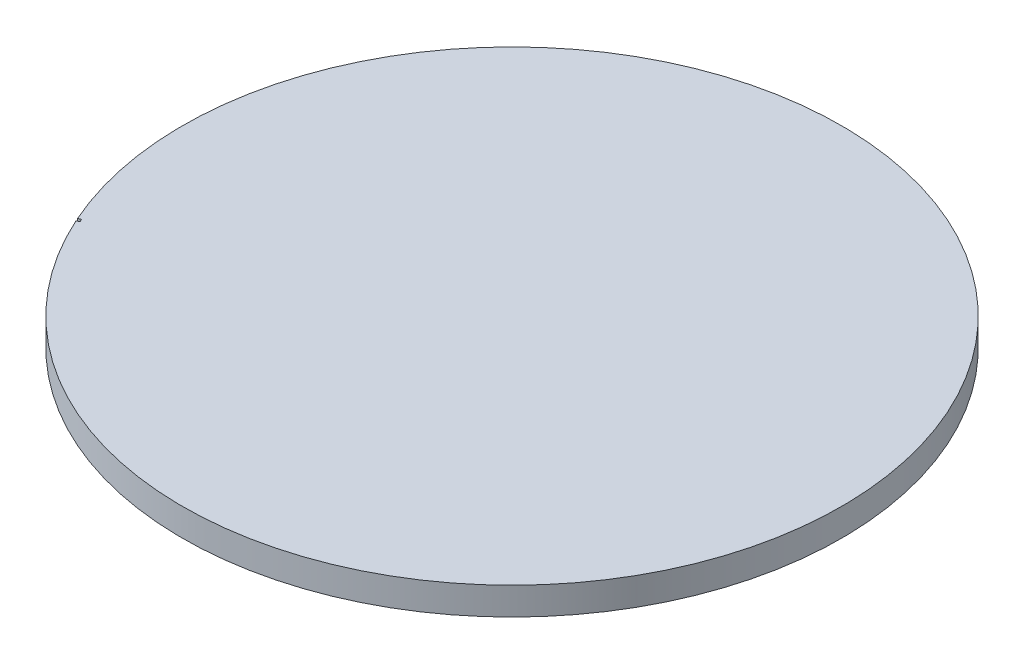
ISO-10303-21;
HEADER;
FILE_DESCRIPTION(('STEP AP214'),'2;1');
FILE_NAME('part.step','',(''),(''),'','','');
FILE_SCHEMA(('AUTOMOTIVE_DESIGN { 1 0 10303 214 1 1 1 1 }'));
ENDSEC;
DATA;
#1=APPLICATION_CONTEXT('core data for automotive mechanical design processes');
#2=APPLICATION_PROTOCOL_DEFINITION('international standard','automotive_design',2000,#1);
#3=PRODUCT_CONTEXT('',#1,'mechanical');
#4=PRODUCT('Part','Part','',(#3));
#5=PRODUCT_RELATED_PRODUCT_CATEGORY('part','',(#4));
#6=PRODUCT_DEFINITION_FORMATION('','',#4);
#7=PRODUCT_DEFINITION_CONTEXT('part definition',#1,'design');
#8=PRODUCT_DEFINITION('design','',#6,#7);
#9=PRODUCT_DEFINITION_SHAPE('','',#8);
#10=(LENGTH_UNIT() NAMED_UNIT(*) SI_UNIT(.MILLI.,.METRE.));
#11=(NAMED_UNIT(*) PLANE_ANGLE_UNIT() SI_UNIT($,.RADIAN.));
#12=(NAMED_UNIT(*) SI_UNIT($,.STERADIAN.) SOLID_ANGLE_UNIT());
#13=UNCERTAINTY_MEASURE_WITH_UNIT(LENGTH_MEASURE(1.E-05),#10,'distance_accuracy_value','');
#14=(GEOMETRIC_REPRESENTATION_CONTEXT(3) GLOBAL_UNCERTAINTY_ASSIGNED_CONTEXT((#13)) GLOBAL_UNIT_ASSIGNED_CONTEXT((#10,
#11,#12)) REPRESENTATION_CONTEXT('',''));
#15=CARTESIAN_POINT('',(0.,0.,0.));
#16=DIRECTION('',(0.,0.,1.));
#17=DIRECTION('',(1.,0.,0.));
#18=AXIS2_PLACEMENT_3D('',#15,#16,#17);
#19=CARTESIAN_POINT('',(0.,4.,0.));
#20=DIRECTION('',(0.,-1.,0.));
#21=DIRECTION('',(0.,0.,-1.));
#22=AXIS2_PLACEMENT_3D('',#19,#20,#21);
#23=PLANE('',#22);
#24=CARTESIAN_POINT('',(0.,4.,0.));
#25=DIRECTION('',(0.,1.,0.));
#26=DIRECTION('',(0.,0.,1.));
#27=AXIS2_PLACEMENT_3D('',#24,#25,#26);
#28=CIRCLE('',#27,90.5);
#29=CARTESIAN_POINT('',(0.,4.,90.5));
#30=VERTEX_POINT('',#29);
#31=EDGE_CURVE('E20',#30,#30,#28,.T.);
#32=ORIENTED_EDGE('',*,*,#31,.F.);
#33=EDGE_LOOP('',(#32));
#34=FACE_BOUND('',#33,.T.);
#35=ADVANCED_FACE('F17',(#34),#23,.T.);
#36=CARTESIAN_POINT('',(0.,4.,0.));
#37=DIRECTION('',(0.,1.,0.));
#38=DIRECTION('',(0.,0.,1.));
#39=AXIS2_PLACEMENT_3D('',#36,#37,#38);
#40=CYLINDRICAL_SURFACE('',#39,90.5);
#41=CARTESIAN_POINT('',(0.,6.,0.));
#42=DIRECTION('',(0.,1.,0.));
#43=DIRECTION('',(0.,0.,1.));
#44=AXIS2_PLACEMENT_3D('',#41,#42,#43);
#45=CIRCLE('',#44,90.5);
#46=CARTESIAN_POINT('',(0.,6.,90.5));
#47=VERTEX_POINT('',#46);
#48=EDGE_CURVE('E89',#47,#47,#45,.T.);
#49=ORIENTED_EDGE('',*,*,#48,.F.);
#50=EDGE_LOOP('',(#49));
#51=FACE_BOUND('',#50,.T.);
#52=ORIENTED_EDGE('',*,*,#31,.T.);
#53=EDGE_LOOP('',(#52));
#54=FACE_BOUND('',#53,.T.);
#55=ADVANCED_FACE('F168',(#51,#54),#40,.T.);
#56=CARTESIAN_POINT('',(-97.0881606494941,19.001,43.7737522642509));
#57=DIRECTION('',(0.913545457642611,0.,-0.406736643075777));
#58=DIRECTION('',(-0.406736643075777,0.,-0.913545457642611));
#59=AXIS2_PLACEMENT_3D('',#56,#57,#58);
#60=PLANE('',#59);
#61=DIRECTION('',(0.,1.,0.));
#62=VECTOR('',#61,1.);
#63=CARTESIAN_POINT('',(-97.0881606494941,19.001,43.7737522642509));
#64=LINE('',#63,#62);
#65=CARTESIAN_POINT('',(-97.0881606494941,6.,43.7737522642509));
#66=VERTEX_POINT('',#65);
#67=CARTESIAN_POINT('',(-97.0881606494941,15.,43.7737522642509));
#68=VERTEX_POINT('',#67);
#69=EDGE_CURVE('E71',#66,#68,#64,.T.);
#70=ORIENTED_EDGE('',*,*,#69,.T.);
#71=DIRECTION('',(-0.406736643075777,0.,-0.913545457642611));
#72=VECTOR('',#71,1.);
#73=CARTESIAN_POINT('',(-97.0881606494941,15.,43.7737522642509));
#74=LINE('',#73,#72);
#75=CARTESIAN_POINT('',(-97.4948972925699,15.,42.8602068066083));
#76=VERTEX_POINT('',#75);
#77=EDGE_CURVE('E64',#76,#68,#74,.F.);
#78=ORIENTED_EDGE('',*,*,#77,.F.);
#79=DIRECTION('',(0.,1.,0.));
#80=VECTOR('',#79,1.);
#81=CARTESIAN_POINT('',(-97.4948972925699,19.001,42.8602068066083));
#82=LINE('',#81,#80);
#83=CARTESIAN_POINT('',(-97.4948972925699,6.,42.8602068066083));
#84=VERTEX_POINT('',#83);
#85=EDGE_CURVE('E58',#76,#84,#82,.F.);
#86=ORIENTED_EDGE('',*,*,#85,.T.);
#87=DIRECTION('',(-0.406736643075788,0.,-0.913545457642606));
#88=VECTOR('',#87,1.);
#89=CARTESIAN_POINT('',(-97.0881606494941,6.,43.7737522642509));
#90=LINE('',#89,#88);
#91=EDGE_CURVE('E74',#66,#84,#90,.T.);
#92=ORIENTED_EDGE('',*,*,#91,.F.);
#93=EDGE_LOOP('',(#70,#78,#86,#92));
#94=FACE_BOUND('',#93,.T.);
#95=ADVANCED_FACE('F73',(#94),#60,.F.);
#96=CARTESIAN_POINT('',(-98.0017061071367,19.001,44.1804889073267));
#97=DIRECTION('',(0.406736643075797,0.,0.913545457642602));
#98=DIRECTION('',(0.913545457642602,0.,-0.406736643075797));
#99=AXIS2_PLACEMENT_3D('',#96,#97,#98);
#100=PLANE('',#99);
#101=DIRECTION('',(0.,1.,0.));
#102=VECTOR('',#101,1.);
#103=CARTESIAN_POINT('',(-98.0017061071367,2.,44.1804889073267));
#104=LINE('',#103,#102);
#105=CARTESIAN_POINT('',(-98.0017061071367,15.,44.1804889073267));
#106=VERTEX_POINT('',#105);
#107=CARTESIAN_POINT('',(-98.0017061071367,6.,44.1804889073267));
#108=VERTEX_POINT('',#107);
#109=EDGE_CURVE('E79',#106,#108,#104,.F.);
#110=ORIENTED_EDGE('',*,*,#109,.F.);
#111=DIRECTION('',(0.913545457642602,0.,-0.406736643075797));
#112=VECTOR('',#111,1.);
#113=CARTESIAN_POINT('',(-98.0017061071367,15.,44.1804889073267));
#114=LINE('',#113,#112);
#115=EDGE_CURVE('E68',#68,#106,#114,.F.);
#116=ORIENTED_EDGE('',*,*,#115,.F.);
#117=ORIENTED_EDGE('',*,*,#69,.F.);
#118=DIRECTION('',(0.913545457642603,0.,-0.406736643075796));
#119=VECTOR('',#118,1.);
#120=CARTESIAN_POINT('',(-98.0017061071367,6.,44.1804889073267));
#121=LINE('',#120,#119);
#122=EDGE_CURVE('E80',#108,#66,#121,.T.);
#123=ORIENTED_EDGE('',*,*,#122,.F.);
#124=EDGE_LOOP('',(#110,#116,#117,#123));
#125=FACE_BOUND('',#124,.T.);
#126=ADVANCED_FACE('F77',(#125),#100,.F.);
#127=CARTESIAN_POINT('',(0.,6.,0.));
#128=DIRECTION('',(0.,-1.,0.));
#129=DIRECTION('',(0.,0.,-1.));
#130=AXIS2_PLACEMENT_3D('',#127,#128,#129);
#131=PLANE('',#130);
#132=ORIENTED_EDGE('',*,*,#48,.T.);
#133=EDGE_LOOP('',(#132));
#134=FACE_BOUND('',#133,.T.);
#135=CARTESIAN_POINT('',(0.,6.,0.));
#136=DIRECTION('',(0.,1.,0.));
#137=DIRECTION('',(0.,0.,1.));
#138=AXIS2_PLACEMENT_3D('',#135,#136,#137);
#139=CIRCLE('',#138,107.5);
#140=CARTESIAN_POINT('',(-98.4084427502125,6.,43.266943449684));
#141=VERTEX_POINT('',#140);
#142=EDGE_CURVE('E50',#108,#141,#139,.T.);
#143=ORIENTED_EDGE('',*,*,#142,.F.);
#144=ORIENTED_EDGE('',*,*,#122,.T.);
#145=ORIENTED_EDGE('',*,*,#91,.T.);
#146=DIRECTION('',(-0.913545457642607,0.,0.406736643075787));
#147=VECTOR('',#146,1.);
#148=CARTESIAN_POINT('',(-97.4948972925699,6.,42.8602068066083));
#149=LINE('',#148,#147);
#150=EDGE_CURVE('E45',#84,#141,#149,.T.);
#151=ORIENTED_EDGE('',*,*,#150,.T.);
#152=EDGE_LOOP('',(#143,#144,#145,#151));
#153=FACE_BOUND('',#152,.T.);
#154=ADVANCED_FACE('F116',(#134,#153),#131,.T.);
#155=CARTESIAN_POINT('',(-97.4948972925699,19.001,42.8602068066083));
#156=DIRECTION('',(-0.406736643075787,0.,-0.913545457642607));
#157=DIRECTION('',(-0.913545457642607,0.,0.406736643075787));
#158=AXIS2_PLACEMENT_3D('',#155,#156,#157);
#159=PLANE('',#158);
#160=ORIENTED_EDGE('',*,*,#85,.F.);
#161=DIRECTION('',(-0.913545457642607,0.,0.406736643075787));
#162=VECTOR('',#161,1.);
#163=CARTESIAN_POINT('',(-97.4948972925699,15.,42.8602068066083));
#164=LINE('',#163,#162);
#165=CARTESIAN_POINT('',(-98.4084427502125,15.,43.266943449684));
#166=VERTEX_POINT('',#165);
#167=EDGE_CURVE('E70',#166,#76,#164,.F.);
#168=ORIENTED_EDGE('',*,*,#167,.F.);
#169=DIRECTION('',(0.,1.,0.));
#170=VECTOR('',#169,1.);
#171=CARTESIAN_POINT('',(-98.4084427502124,2.,43.266943449684));
#172=LINE('',#171,#170);
#173=EDGE_CURVE('E26',#141,#166,#172,.T.);
#174=ORIENTED_EDGE('',*,*,#173,.F.);
#175=ORIENTED_EDGE('',*,*,#150,.F.);
#176=EDGE_LOOP('',(#160,#168,#174,#175));
#177=FACE_BOUND('',#176,.T.);
#178=ADVANCED_FACE('F114',(#177),#159,.F.);
#179=CARTESIAN_POINT('',(0.,2.,0.));
#180=DIRECTION('',(0.,1.,0.));
#181=DIRECTION('',(0.,0.,1.));
#182=AXIS2_PLACEMENT_3D('',#179,#180,#181);
#183=CYLINDRICAL_SURFACE('',#182,107.5);
#184=ORIENTED_EDGE('',*,*,#173,.T.);
#185=CARTESIAN_POINT('',(0.,15.,0.));
#186=DIRECTION('',(0.,1.,0.));
#187=DIRECTION('',(0.,0.,1.));
#188=AXIS2_PLACEMENT_3D('',#185,#186,#187);
#189=CIRCLE('',#188,107.5);
#190=EDGE_CURVE('E11',#106,#166,#189,.T.);
#191=ORIENTED_EDGE('',*,*,#190,.F.);
#192=ORIENTED_EDGE('',*,*,#109,.T.);
#193=ORIENTED_EDGE('',*,*,#142,.T.);
#194=EDGE_LOOP('',(#184,#191,#192,#193));
#195=FACE_BOUND('',#194,.T.);
#196=ADVANCED_FACE('F112',(#195),#183,.T.);
#197=CARTESIAN_POINT('',(0.,15.,0.));
#198=DIRECTION('',(0.,1.,0.));
#199=DIRECTION('',(0.,0.,1.));
#200=AXIS2_PLACEMENT_3D('',#197,#198,#199);
#201=PLANE('',#200);
#202=ORIENTED_EDGE('',*,*,#167,.T.);
#203=ORIENTED_EDGE('',*,*,#77,.T.);
#204=ORIENTED_EDGE('',*,*,#115,.T.);
#205=ORIENTED_EDGE('',*,*,#190,.T.);
#206=EDGE_LOOP('',(#202,#203,#204,#205));
#207=FACE_BOUND('',#206,.T.);
#208=ADVANCED_FACE('F66',(#207),#201,.T.);
#209=CLOSED_SHELL('',(#35,#55,#95,#126,#154,#178,#196,#208));
#210=MANIFOLD_SOLID_BREP('B1',#209);
#211=ADVANCED_BREP_SHAPE_REPRESENTATION('',(#18,#210),#14);
#212=SHAPE_DEFINITION_REPRESENTATION(#9,#211);
ENDSEC;
END-ISO-10303-21;
